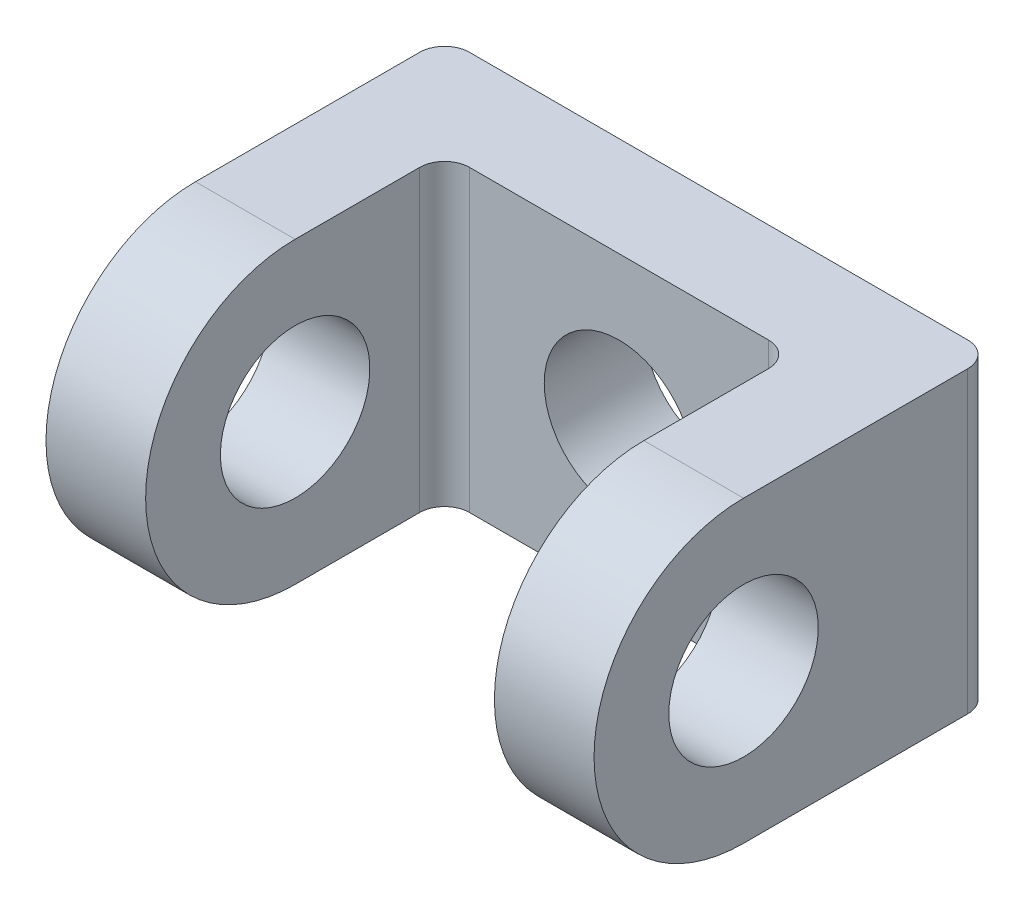
ISO-10303-21;
HEADER;
FILE_DESCRIPTION(('STEP AP214'),'2;1');
FILE_NAME('part.step','',(''),(''),'','','');
FILE_SCHEMA(('AUTOMOTIVE_DESIGN { 1 0 10303 214 1 1 1 1 }'));
ENDSEC;
DATA;
#1=APPLICATION_CONTEXT('core data for automotive mechanical design processes');
#2=APPLICATION_PROTOCOL_DEFINITION('international standard','automotive_design',2000,#1);
#3=PRODUCT_CONTEXT('',#1,'mechanical');
#4=PRODUCT('Part','Part','',(#3));
#5=PRODUCT_RELATED_PRODUCT_CATEGORY('part','',(#4));
#6=PRODUCT_DEFINITION_FORMATION('','',#4);
#7=PRODUCT_DEFINITION_CONTEXT('part definition',#1,'design');
#8=PRODUCT_DEFINITION('design','',#6,#7);
#9=PRODUCT_DEFINITION_SHAPE('','',#8);
#10=(LENGTH_UNIT() NAMED_UNIT(*) SI_UNIT(.MILLI.,.METRE.));
#11=(NAMED_UNIT(*) PLANE_ANGLE_UNIT() SI_UNIT($,.RADIAN.));
#12=(NAMED_UNIT(*) SI_UNIT($,.STERADIAN.) SOLID_ANGLE_UNIT());
#13=UNCERTAINTY_MEASURE_WITH_UNIT(LENGTH_MEASURE(1.E-05),#10,'distance_accuracy_value','');
#14=(GEOMETRIC_REPRESENTATION_CONTEXT(3) GLOBAL_UNCERTAINTY_ASSIGNED_CONTEXT((#13)) GLOBAL_UNIT_ASSIGNED_CONTEXT((#10,
#11,#12)) REPRESENTATION_CONTEXT('',''));
#15=CARTESIAN_POINT('',(0.,0.,0.));
#16=DIRECTION('',(0.,0.,1.));
#17=DIRECTION('',(1.,0.,0.));
#18=AXIS2_PLACEMENT_3D('',#15,#16,#17);
#19=CARTESIAN_POINT('',(55.,0.,0.));
#20=DIRECTION('',(-1.,0.,0.));
#21=DIRECTION('',(0.,0.,1.));
#22=AXIS2_PLACEMENT_3D('',#19,#20,#21);
#23=CYLINDRICAL_SURFACE('',#22,30.);
#24=CARTESIAN_POINT('',(-35.,0.,0.));
#25=DIRECTION('',(-1.,0.,0.));
#26=DIRECTION('',(0.,0.,1.));
#27=AXIS2_PLACEMENT_3D('',#24,#25,#26);
#28=CIRCLE('',#27,30.);
#29=CARTESIAN_POINT('',(-35.,-30.,0.));
#30=VERTEX_POINT('',#29);
#31=CARTESIAN_POINT('',(-35.,30.,0.));
#32=VERTEX_POINT('',#31);
#33=EDGE_CURVE('E148',#30,#32,#28,.T.);
#34=ORIENTED_EDGE('',*,*,#33,.T.);
#35=DIRECTION('',(-1.,0.,0.));
#36=VECTOR('',#35,1.);
#37=CARTESIAN_POINT('',(55.,30.,0.));
#38=LINE('',#37,#36);
#39=CARTESIAN_POINT('',(-55.,30.,0.));
#40=VERTEX_POINT('',#39);
#41=EDGE_CURVE('E270',#32,#40,#38,.T.);
#42=ORIENTED_EDGE('',*,*,#41,.T.);
#43=CARTESIAN_POINT('',(-55.,0.,0.));
#44=DIRECTION('',(1.,0.,0.));
#45=DIRECTION('',(0.,0.,-1.));
#46=AXIS2_PLACEMENT_3D('',#43,#44,#45);
#47=CIRCLE('',#46,30.);
#48=CARTESIAN_POINT('',(-55.,-30.,0.));
#49=VERTEX_POINT('',#48);
#50=EDGE_CURVE('E260',#40,#49,#47,.T.);
#51=ORIENTED_EDGE('',*,*,#50,.T.);
#52=DIRECTION('',(-1.,0.,0.));
#53=VECTOR('',#52,1.);
#54=CARTESIAN_POINT('',(55.,-30.,0.));
#55=LINE('',#54,#53);
#56=EDGE_CURVE('E165',#30,#49,#55,.T.);
#57=ORIENTED_EDGE('',*,*,#56,.F.);
#58=EDGE_LOOP('',(#34,#42,#51,#57));
#59=FACE_BOUND('',#58,.T.);
#60=ADVANCED_FACE('F45',(#59),#23,.T.);
#61=CARTESIAN_POINT('',(55.,30.,0.));
#62=VERTEX_POINT('',#61);
#63=CARTESIAN_POINT('',(35.,30.,0.));
#64=VERTEX_POINT('',#63);
#65=EDGE_CURVE('E146',#62,#64,#38,.T.);
#66=ORIENTED_EDGE('',*,*,#65,.T.);
#67=CARTESIAN_POINT('',(35.,0.,0.));
#68=DIRECTION('',(1.,0.,0.));
#69=DIRECTION('',(0.,0.,-1.));
#70=AXIS2_PLACEMENT_3D('',#67,#68,#69);
#71=CIRCLE('',#70,30.);
#72=CARTESIAN_POINT('',(35.,-30.,0.));
#73=VERTEX_POINT('',#72);
#74=EDGE_CURVE('E140',#64,#73,#71,.T.);
#75=ORIENTED_EDGE('',*,*,#74,.T.);
#76=CARTESIAN_POINT('',(55.,-30.,0.));
#77=VERTEX_POINT('',#76);
#78=EDGE_CURVE('E144',#77,#73,#55,.T.);
#79=ORIENTED_EDGE('',*,*,#78,.F.);
#80=CARTESIAN_POINT('',(55.,0.,0.));
#81=DIRECTION('',(1.,0.,0.));
#82=DIRECTION('',(0.,0.,-1.));
#83=AXIS2_PLACEMENT_3D('',#80,#81,#82);
#84=CIRCLE('',#83,30.);
#85=EDGE_CURVE('E261',#62,#77,#84,.T.);
#86=ORIENTED_EDGE('',*,*,#85,.F.);
#87=EDGE_LOOP('',(#66,#75,#79,#86));
#88=FACE_BOUND('',#87,.T.);
#89=ADVANCED_FACE('F141',(#88),#23,.T.);
#90=CARTESIAN_POINT('',(55.,-30.,-50.));
#91=DIRECTION('',(0.,1.,0.));
#92=DIRECTION('',(0.,0.,1.));
#93=AXIS2_PLACEMENT_3D('',#90,#91,#92);
#94=PLANE('',#93);
#95=DIRECTION('',(-1.,0.,0.));
#96=VECTOR('',#95,1.);
#97=CARTESIAN_POINT('',(55.,-30.,-50.));
#98=LINE('',#97,#96);
#99=CARTESIAN_POINT('',(50.,-30.,-50.));
#100=VERTEX_POINT('',#99);
#101=CARTESIAN_POINT('',(-50.,-30.,-50.));
#102=VERTEX_POINT('',#101);
#103=EDGE_CURVE('E171',#100,#102,#98,.T.);
#104=ORIENTED_EDGE('',*,*,#103,.F.);
#105=CARTESIAN_POINT('',(50.,-30.,-45.));
#106=DIRECTION('',(0.,1.,0.));
#107=DIRECTION('',(0.,0.,1.));
#108=AXIS2_PLACEMENT_3D('',#105,#106,#107);
#109=CIRCLE('',#108,5.);
#110=CARTESIAN_POINT('',(55.,-30.,-45.));
#111=VERTEX_POINT('',#110);
#112=EDGE_CURVE('E200',#100,#111,#109,.F.);
#113=ORIENTED_EDGE('',*,*,#112,.T.);
#114=DIRECTION('',(0.,0.,-1.));
#115=VECTOR('',#114,1.);
#116=CARTESIAN_POINT('',(55.,-30.,-50.));
#117=LINE('',#116,#115);
#118=EDGE_CURVE('E161',#77,#111,#117,.T.);
#119=ORIENTED_EDGE('',*,*,#118,.F.);
#120=ORIENTED_EDGE('',*,*,#78,.T.);
#121=DIRECTION('',(0.,0.,-1.));
#122=VECTOR('',#121,1.);
#123=CARTESIAN_POINT('',(35.,-30.,-30.));
#124=LINE('',#123,#122);
#125=CARTESIAN_POINT('',(35.,-30.,-25.));
#126=VERTEX_POINT('',#125);
#127=EDGE_CURVE('E151',#73,#126,#124,.T.);
#128=ORIENTED_EDGE('',*,*,#127,.T.);
#129=CARTESIAN_POINT('',(30.,-30.,-25.));
#130=DIRECTION('',(0.,1.,0.));
#131=DIRECTION('',(0.,0.,1.));
#132=AXIS2_PLACEMENT_3D('',#129,#130,#131);
#133=CIRCLE('',#132,5.);
#134=CARTESIAN_POINT('',(30.,-30.,-30.));
#135=VERTEX_POINT('',#134);
#136=EDGE_CURVE('E221',#126,#135,#133,.T.);
#137=ORIENTED_EDGE('',*,*,#136,.T.);
#138=DIRECTION('',(-1.,0.,0.));
#139=VECTOR('',#138,1.);
#140=CARTESIAN_POINT('',(-35.,-30.,-30.));
#141=LINE('',#140,#139);
#142=CARTESIAN_POINT('',(-30.,-30.,-30.));
#143=VERTEX_POINT('',#142);
#144=EDGE_CURVE('E149',#135,#143,#141,.T.);
#145=ORIENTED_EDGE('',*,*,#144,.T.);
#146=CARTESIAN_POINT('',(-30.,-30.,-25.));
#147=DIRECTION('',(0.,1.,0.));
#148=DIRECTION('',(0.,0.,1.));
#149=AXIS2_PLACEMENT_3D('',#146,#147,#148);
#150=CIRCLE('',#149,5.);
#151=CARTESIAN_POINT('',(-35.,-30.,-25.));
#152=VERTEX_POINT('',#151);
#153=EDGE_CURVE('E11',#143,#152,#150,.T.);
#154=ORIENTED_EDGE('',*,*,#153,.T.);
#155=DIRECTION('',(0.,0.,1.));
#156=VECTOR('',#155,1.);
#157=CARTESIAN_POINT('',(-35.,-30.,-30.));
#158=LINE('',#157,#156);
#159=EDGE_CURVE('E156',#152,#30,#158,.T.);
#160=ORIENTED_EDGE('',*,*,#159,.T.);
#161=ORIENTED_EDGE('',*,*,#56,.T.);
#162=DIRECTION('',(0.,0.,-1.));
#163=VECTOR('',#162,1.);
#164=CARTESIAN_POINT('',(-55.,-30.,-50.));
#165=LINE('',#164,#163);
#166=CARTESIAN_POINT('',(-55.,-30.,-45.));
#167=VERTEX_POINT('',#166);
#168=EDGE_CURVE('E274',#49,#167,#165,.T.);
#169=ORIENTED_EDGE('',*,*,#168,.T.);
#170=CARTESIAN_POINT('',(-50.,-30.,-45.));
#171=DIRECTION('',(0.,1.,0.));
#172=DIRECTION('',(0.,0.,1.));
#173=AXIS2_PLACEMENT_3D('',#170,#171,#172);
#174=CIRCLE('',#173,5.);
#175=EDGE_CURVE('E197',#167,#102,#174,.F.);
#176=ORIENTED_EDGE('',*,*,#175,.T.);
#177=EDGE_LOOP('',(#104,#113,#119,#120,#128,#137,#145,#154,#160,#161,#169,#176));
#178=FACE_BOUND('',#177,.T.);
#179=ADVANCED_FACE('F159',(#178),#94,.F.);
#180=CARTESIAN_POINT('',(55.,30.,-50.));
#181=DIRECTION('',(0.,0.,1.));
#182=DIRECTION('',(1.,0.,0.));
#183=AXIS2_PLACEMENT_3D('',#180,#181,#182);
#184=PLANE('',#183);
#185=CARTESIAN_POINT('',(0.,0.,-50.));
#186=DIRECTION('',(0.,0.,1.));
#187=DIRECTION('',(1.,0.,0.));
#188=AXIS2_PLACEMENT_3D('',#185,#186,#187);
#189=CIRCLE('',#188,15.);
#190=CARTESIAN_POINT('',(15.,0.,-50.));
#191=VERTEX_POINT('',#190);
#192=EDGE_CURVE('E356',#191,#191,#189,.T.);
#193=ORIENTED_EDGE('',*,*,#192,.T.);
#194=EDGE_LOOP('',(#193));
#195=FACE_BOUND('',#194,.T.);
#196=DIRECTION('',(-1.,0.,0.));
#197=VECTOR('',#196,1.);
#198=CARTESIAN_POINT('',(55.,30.,-50.));
#199=LINE('',#198,#197);
#200=CARTESIAN_POINT('',(50.,30.,-50.));
#201=VERTEX_POINT('',#200);
#202=CARTESIAN_POINT('',(-50.,30.,-50.));
#203=VERTEX_POINT('',#202);
#204=EDGE_CURVE('E280',#201,#203,#199,.T.);
#205=ORIENTED_EDGE('',*,*,#204,.F.);
#206=DIRECTION('',(0.,1.,0.));
#207=VECTOR('',#206,1.);
#208=CARTESIAN_POINT('',(50.,-30.,-50.));
#209=LINE('',#208,#207);
#210=EDGE_CURVE('E194',#201,#100,#209,.F.);
#211=ORIENTED_EDGE('',*,*,#210,.T.);
#212=ORIENTED_EDGE('',*,*,#103,.T.);
#213=DIRECTION('',(0.,1.,0.));
#214=VECTOR('',#213,1.);
#215=CARTESIAN_POINT('',(-50.,30.,-50.));
#216=LINE('',#215,#214);
#217=EDGE_CURVE('E190',#102,#203,#216,.T.);
#218=ORIENTED_EDGE('',*,*,#217,.T.);
#219=EDGE_LOOP('',(#205,#211,#212,#218));
#220=FACE_BOUND('',#219,.T.);
#221=ADVANCED_FACE('F288',(#195,#220),#184,.F.);
#222=CARTESIAN_POINT('',(55.,30.,0.));
#223=DIRECTION('',(0.,-1.,0.));
#224=DIRECTION('',(0.,0.,-1.));
#225=AXIS2_PLACEMENT_3D('',#222,#223,#224);
#226=PLANE('',#225);
#227=DIRECTION('',(0.,0.,1.));
#228=VECTOR('',#227,1.);
#229=CARTESIAN_POINT('',(55.,30.,0.));
#230=LINE('',#229,#228);
#231=CARTESIAN_POINT('',(55.,30.,-45.));
#232=VERTEX_POINT('',#231);
#233=EDGE_CURVE('E267',#232,#62,#230,.T.);
#234=ORIENTED_EDGE('',*,*,#233,.F.);
#235=CARTESIAN_POINT('',(50.,30.,-45.));
#236=DIRECTION('',(0.,-1.,0.));
#237=DIRECTION('',(0.,0.,-1.));
#238=AXIS2_PLACEMENT_3D('',#235,#236,#237);
#239=CIRCLE('',#238,5.);
#240=EDGE_CURVE('E187',#232,#201,#239,.F.);
#241=ORIENTED_EDGE('',*,*,#240,.T.);
#242=ORIENTED_EDGE('',*,*,#204,.T.);
#243=CARTESIAN_POINT('',(-50.,30.,-45.));
#244=DIRECTION('',(0.,-1.,0.));
#245=DIRECTION('',(0.,0.,-1.));
#246=AXIS2_PLACEMENT_3D('',#243,#244,#245);
#247=CIRCLE('',#246,5.);
#248=CARTESIAN_POINT('',(-55.,30.,-45.));
#249=VERTEX_POINT('',#248);
#250=EDGE_CURVE('E184',#203,#249,#247,.F.);
#251=ORIENTED_EDGE('',*,*,#250,.T.);
#252=DIRECTION('',(0.,0.,1.));
#253=VECTOR('',#252,1.);
#254=CARTESIAN_POINT('',(-55.,30.,0.));
#255=LINE('',#254,#253);
#256=EDGE_CURVE('E264',#249,#40,#255,.T.);
#257=ORIENTED_EDGE('',*,*,#256,.T.);
#258=ORIENTED_EDGE('',*,*,#41,.F.);
#259=DIRECTION('',(0.,0.,1.));
#260=VECTOR('',#259,1.);
#261=CARTESIAN_POINT('',(-35.,30.,-30.));
#262=LINE('',#261,#260);
#263=CARTESIAN_POINT('',(-35.,30.,-25.));
#264=VERTEX_POINT('',#263);
#265=EDGE_CURVE('E233',#264,#32,#262,.T.);
#266=ORIENTED_EDGE('',*,*,#265,.F.);
#267=CARTESIAN_POINT('',(-30.,30.,-25.));
#268=DIRECTION('',(0.,-1.,0.));
#269=DIRECTION('',(0.,0.,-1.));
#270=AXIS2_PLACEMENT_3D('',#267,#268,#269);
#271=CIRCLE('',#270,5.);
#272=CARTESIAN_POINT('',(-30.,30.,-30.));
#273=VERTEX_POINT('',#272);
#274=EDGE_CURVE('E55',#264,#273,#271,.T.);
#275=ORIENTED_EDGE('',*,*,#274,.T.);
#276=DIRECTION('',(-1.,0.,0.));
#277=VECTOR('',#276,1.);
#278=CARTESIAN_POINT('',(-35.,30.,-30.));
#279=LINE('',#278,#277);
#280=CARTESIAN_POINT('',(30.,30.,-30.));
#281=VERTEX_POINT('',#280);
#282=EDGE_CURVE('E231',#281,#273,#279,.T.);
#283=ORIENTED_EDGE('',*,*,#282,.F.);
#284=CARTESIAN_POINT('',(30.,30.,-25.));
#285=DIRECTION('',(0.,-1.,0.));
#286=DIRECTION('',(0.,0.,-1.));
#287=AXIS2_PLACEMENT_3D('',#284,#285,#286);
#288=CIRCLE('',#287,5.);
#289=CARTESIAN_POINT('',(35.,30.,-25.));
#290=VERTEX_POINT('',#289);
#291=EDGE_CURVE('E218',#281,#290,#288,.T.);
#292=ORIENTED_EDGE('',*,*,#291,.T.);
#293=DIRECTION('',(0.,0.,1.));
#294=VECTOR('',#293,1.);
#295=CARTESIAN_POINT('',(35.,30.,0.));
#296=LINE('',#295,#294);
#297=EDGE_CURVE('E164',#290,#64,#296,.T.);
#298=ORIENTED_EDGE('',*,*,#297,.T.);
#299=ORIENTED_EDGE('',*,*,#65,.F.);
#300=EDGE_LOOP('',(#234,#241,#242,#251,#257,#258,#266,#275,#283,#292,#298,#299));
#301=FACE_BOUND('',#300,.T.);
#302=ADVANCED_FACE('F230',(#301),#226,.F.);
#303=CARTESIAN_POINT('',(55.,0.,0.));
#304=DIRECTION('',(1.,0.,0.));
#305=DIRECTION('',(0.,0.,-1.));
#306=AXIS2_PLACEMENT_3D('',#303,#304,#305);
#307=PLANE('',#306);
#308=CARTESIAN_POINT('',(55.,0.,0.));
#309=DIRECTION('',(-1.,0.,0.));
#310=DIRECTION('',(0.,0.,1.));
#311=AXIS2_PLACEMENT_3D('',#308,#309,#310);
#312=CIRCLE('',#311,15.);
#313=CARTESIAN_POINT('',(55.,0.,15.));
#314=VERTEX_POINT('',#313);
#315=EDGE_CURVE('E180',#314,#314,#312,.T.);
#316=ORIENTED_EDGE('',*,*,#315,.T.);
#317=EDGE_LOOP('',(#316));
#318=FACE_BOUND('',#317,.T.);
#319=ORIENTED_EDGE('',*,*,#118,.T.);
#320=DIRECTION('',(0.,1.,0.));
#321=VECTOR('',#320,1.);
#322=CARTESIAN_POINT('',(55.,30.,-45.));
#323=LINE('',#322,#321);
#324=EDGE_CURVE('E169',#111,#232,#323,.T.);
#325=ORIENTED_EDGE('',*,*,#324,.T.);
#326=ORIENTED_EDGE('',*,*,#233,.T.);
#327=ORIENTED_EDGE('',*,*,#85,.T.);
#328=EDGE_LOOP('',(#319,#325,#326,#327));
#329=FACE_BOUND('',#328,.T.);
#330=ADVANCED_FACE('F343',(#318,#329),#307,.T.);
#331=CARTESIAN_POINT('',(-55.,0.,0.));
#332=DIRECTION('',(1.,0.,0.));
#333=DIRECTION('',(0.,0.,-1.));
#334=AXIS2_PLACEMENT_3D('',#331,#332,#333);
#335=PLANE('',#334);
#336=CARTESIAN_POINT('',(-55.,0.,0.));
#337=DIRECTION('',(1.,0.,0.));
#338=DIRECTION('',(0.,0.,-1.));
#339=AXIS2_PLACEMENT_3D('',#336,#337,#338);
#340=CIRCLE('',#339,15.);
#341=CARTESIAN_POINT('',(-55.,0.,-15.));
#342=VERTEX_POINT('',#341);
#343=EDGE_CURVE('E368',#342,#342,#340,.T.);
#344=ORIENTED_EDGE('',*,*,#343,.T.);
#345=EDGE_LOOP('',(#344));
#346=FACE_BOUND('',#345,.T.);
#347=ORIENTED_EDGE('',*,*,#256,.F.);
#348=DIRECTION('',(0.,1.,0.));
#349=VECTOR('',#348,1.);
#350=CARTESIAN_POINT('',(-55.,0.,-45.));
#351=LINE('',#350,#349);
#352=EDGE_CURVE('E70',#249,#167,#351,.F.);
#353=ORIENTED_EDGE('',*,*,#352,.T.);
#354=ORIENTED_EDGE('',*,*,#168,.F.);
#355=ORIENTED_EDGE('',*,*,#50,.F.);
#356=EDGE_LOOP('',(#347,#353,#354,#355));
#357=FACE_BOUND('',#356,.T.);
#358=ADVANCED_FACE('F295',(#346,#357),#335,.F.);
#359=CARTESIAN_POINT('',(-35.,-30.,-30.));
#360=DIRECTION('',(-1.,0.,0.));
#361=DIRECTION('',(0.,0.,1.));
#362=AXIS2_PLACEMENT_3D('',#359,#360,#361);
#363=PLANE('',#362);
#364=CARTESIAN_POINT('',(-35.,0.,0.));
#365=DIRECTION('',(-1.,0.,0.));
#366=DIRECTION('',(0.,0.,1.));
#367=AXIS2_PLACEMENT_3D('',#364,#365,#366);
#368=CIRCLE('',#367,15.);
#369=CARTESIAN_POINT('',(-35.,0.,15.));
#370=VERTEX_POINT('',#369);
#371=EDGE_CURVE('E179',#370,#370,#368,.T.);
#372=ORIENTED_EDGE('',*,*,#371,.T.);
#373=EDGE_LOOP('',(#372));
#374=FACE_BOUND('',#373,.T.);
#375=ORIENTED_EDGE('',*,*,#159,.F.);
#376=DIRECTION('',(0.,1.,0.));
#377=VECTOR('',#376,1.);
#378=CARTESIAN_POINT('',(-35.,30.,-25.));
#379=LINE('',#378,#377);
#380=EDGE_CURVE('E212',#152,#264,#379,.T.);
#381=ORIENTED_EDGE('',*,*,#380,.T.);
#382=ORIENTED_EDGE('',*,*,#265,.T.);
#383=ORIENTED_EDGE('',*,*,#33,.F.);
#384=EDGE_LOOP('',(#375,#381,#382,#383));
#385=FACE_BOUND('',#384,.T.);
#386=ADVANCED_FACE('F249',(#374,#385),#363,.F.);
#387=CARTESIAN_POINT('',(35.,-30.,-30.));
#388=DIRECTION('',(1.,0.,0.));
#389=DIRECTION('',(0.,0.,-1.));
#390=AXIS2_PLACEMENT_3D('',#387,#388,#389);
#391=PLANE('',#390);
#392=CARTESIAN_POINT('',(35.,0.,0.));
#393=DIRECTION('',(1.,0.,0.));
#394=DIRECTION('',(0.,0.,-1.));
#395=AXIS2_PLACEMENT_3D('',#392,#393,#394);
#396=CIRCLE('',#395,15.);
#397=CARTESIAN_POINT('',(35.,0.,-15.));
#398=VERTEX_POINT('',#397);
#399=EDGE_CURVE('E175',#398,#398,#396,.T.);
#400=ORIENTED_EDGE('',*,*,#399,.T.);
#401=EDGE_LOOP('',(#400));
#402=FACE_BOUND('',#401,.T.);
#403=ORIENTED_EDGE('',*,*,#297,.F.);
#404=DIRECTION('',(0.,1.,0.));
#405=VECTOR('',#404,1.);
#406=CARTESIAN_POINT('',(35.,-30.,-25.));
#407=LINE('',#406,#405);
#408=EDGE_CURVE('E62',#290,#126,#407,.F.);
#409=ORIENTED_EDGE('',*,*,#408,.T.);
#410=ORIENTED_EDGE('',*,*,#127,.F.);
#411=ORIENTED_EDGE('',*,*,#74,.F.);
#412=EDGE_LOOP('',(#403,#409,#410,#411));
#413=FACE_BOUND('',#412,.T.);
#414=ADVANCED_FACE('F152',(#402,#413),#391,.F.);
#415=CARTESIAN_POINT('',(-35.,-30.,-30.));
#416=DIRECTION('',(0.,0.,-1.));
#417=DIRECTION('',(-1.,0.,0.));
#418=AXIS2_PLACEMENT_3D('',#415,#416,#417);
#419=PLANE('',#418);
#420=CARTESIAN_POINT('',(0.,0.,-30.));
#421=DIRECTION('',(0.,0.,-1.));
#422=DIRECTION('',(-1.,0.,0.));
#423=AXIS2_PLACEMENT_3D('',#420,#421,#422);
#424=CIRCLE('',#423,15.);
#425=CARTESIAN_POINT('',(-15.,0.,-30.));
#426=VERTEX_POINT('',#425);
#427=EDGE_CURVE('E49',#426,#426,#424,.T.);
#428=ORIENTED_EDGE('',*,*,#427,.T.);
#429=EDGE_LOOP('',(#428));
#430=FACE_BOUND('',#429,.T.);
#431=ORIENTED_EDGE('',*,*,#144,.F.);
#432=DIRECTION('',(0.,1.,0.));
#433=VECTOR('',#432,1.);
#434=CARTESIAN_POINT('',(30.,30.,-30.));
#435=LINE('',#434,#433);
#436=EDGE_CURVE('E206',#135,#281,#435,.T.);
#437=ORIENTED_EDGE('',*,*,#436,.T.);
#438=ORIENTED_EDGE('',*,*,#282,.T.);
#439=DIRECTION('',(0.,1.,0.));
#440=VECTOR('',#439,1.);
#441=CARTESIAN_POINT('',(-30.,-30.,-30.));
#442=LINE('',#441,#440);
#443=EDGE_CURVE('E203',#273,#143,#442,.F.);
#444=ORIENTED_EDGE('',*,*,#443,.T.);
#445=EDGE_LOOP('',(#431,#437,#438,#444));
#446=FACE_BOUND('',#445,.T.);
#447=ADVANCED_FACE('F239',(#430,#446),#419,.F.);
#448=CARTESIAN_POINT('',(55.,0.,0.));
#449=DIRECTION('',(-1.,0.,0.));
#450=DIRECTION('',(0.,0.,1.));
#451=AXIS2_PLACEMENT_3D('',#448,#449,#450);
#452=CYLINDRICAL_SURFACE('',#451,15.);
#453=ORIENTED_EDGE('',*,*,#315,.F.);
#454=EDGE_LOOP('',(#453));
#455=FACE_BOUND('',#454,.T.);
#456=ORIENTED_EDGE('',*,*,#399,.F.);
#457=EDGE_LOOP('',(#456));
#458=FACE_BOUND('',#457,.T.);
#459=ADVANCED_FACE('F333',(#455,#458),#452,.F.);
#460=ORIENTED_EDGE('',*,*,#371,.F.);
#461=EDGE_LOOP('',(#460));
#462=FACE_BOUND('',#461,.T.);
#463=ORIENTED_EDGE('',*,*,#343,.F.);
#464=EDGE_LOOP('',(#463));
#465=FACE_BOUND('',#464,.T.);
#466=ADVANCED_FACE('F310',(#462,#465),#452,.F.);
#467=CARTESIAN_POINT('',(50.,0.,-45.));
#468=DIRECTION('',(0.,-1.,0.));
#469=DIRECTION('',(0.,0.,-1.));
#470=AXIS2_PLACEMENT_3D('',#467,#468,#469);
#471=CYLINDRICAL_SURFACE('',#470,5.);
#472=ORIENTED_EDGE('',*,*,#112,.F.);
#473=ORIENTED_EDGE('',*,*,#210,.F.);
#474=ORIENTED_EDGE('',*,*,#240,.F.);
#475=ORIENTED_EDGE('',*,*,#324,.F.);
#476=EDGE_LOOP('',(#472,#473,#474,#475));
#477=FACE_BOUND('',#476,.T.);
#478=ADVANCED_FACE('F306',(#477),#471,.T.);
#479=CARTESIAN_POINT('',(30.,-30.,-25.));
#480=DIRECTION('',(0.,-1.,0.));
#481=DIRECTION('',(0.,0.,-1.));
#482=AXIS2_PLACEMENT_3D('',#479,#480,#481);
#483=CYLINDRICAL_SURFACE('',#482,5.);
#484=ORIENTED_EDGE('',*,*,#136,.F.);
#485=ORIENTED_EDGE('',*,*,#408,.F.);
#486=ORIENTED_EDGE('',*,*,#291,.F.);
#487=ORIENTED_EDGE('',*,*,#436,.F.);
#488=EDGE_LOOP('',(#484,#485,#486,#487));
#489=FACE_BOUND('',#488,.T.);
#490=ADVANCED_FACE('F309',(#489),#483,.F.);
#491=CARTESIAN_POINT('',(-30.,-30.,-25.));
#492=DIRECTION('',(0.,-1.,0.));
#493=DIRECTION('',(0.,0.,-1.));
#494=AXIS2_PLACEMENT_3D('',#491,#492,#493);
#495=CYLINDRICAL_SURFACE('',#494,5.);
#496=ORIENTED_EDGE('',*,*,#153,.F.);
#497=ORIENTED_EDGE('',*,*,#443,.F.);
#498=ORIENTED_EDGE('',*,*,#274,.F.);
#499=ORIENTED_EDGE('',*,*,#380,.F.);
#500=EDGE_LOOP('',(#496,#497,#498,#499));
#501=FACE_BOUND('',#500,.T.);
#502=ADVANCED_FACE('F245',(#501),#495,.F.);
#503=CARTESIAN_POINT('',(-50.,30.,-45.));
#504=DIRECTION('',(0.,1.,0.));
#505=DIRECTION('',(0.,0.,1.));
#506=AXIS2_PLACEMENT_3D('',#503,#504,#505);
#507=CYLINDRICAL_SURFACE('',#506,5.);
#508=ORIENTED_EDGE('',*,*,#175,.F.);
#509=ORIENTED_EDGE('',*,*,#352,.F.);
#510=ORIENTED_EDGE('',*,*,#250,.F.);
#511=ORIENTED_EDGE('',*,*,#217,.F.);
#512=EDGE_LOOP('',(#508,#509,#510,#511));
#513=FACE_BOUND('',#512,.T.);
#514=ADVANCED_FACE('F47',(#513),#507,.T.);
#515=CARTESIAN_POINT('',(0.,0.,-50.));
#516=DIRECTION('',(0.,0.,1.));
#517=DIRECTION('',(1.,0.,0.));
#518=AXIS2_PLACEMENT_3D('',#515,#516,#517);
#519=CYLINDRICAL_SURFACE('',#518,15.);
#520=ORIENTED_EDGE('',*,*,#192,.F.);
#521=EDGE_LOOP('',(#520));
#522=FACE_BOUND('',#521,.T.);
#523=ORIENTED_EDGE('',*,*,#427,.F.);
#524=EDGE_LOOP('',(#523));
#525=FACE_BOUND('',#524,.T.);
#526=ADVANCED_FACE('F318',(#522,#525),#519,.F.);
#527=CLOSED_SHELL('',(#60,#89,#179,#221,#302,#330,#358,#386,#414,#447,#459,#466,#478,#490,#502,
#514,#526));
#528=MANIFOLD_SOLID_BREP('B2',#527);
#529=ADVANCED_BREP_SHAPE_REPRESENTATION('',(#18,#528),#14);
#530=SHAPE_DEFINITION_REPRESENTATION(#9,#529);
ENDSEC;
END-ISO-10303-21;
